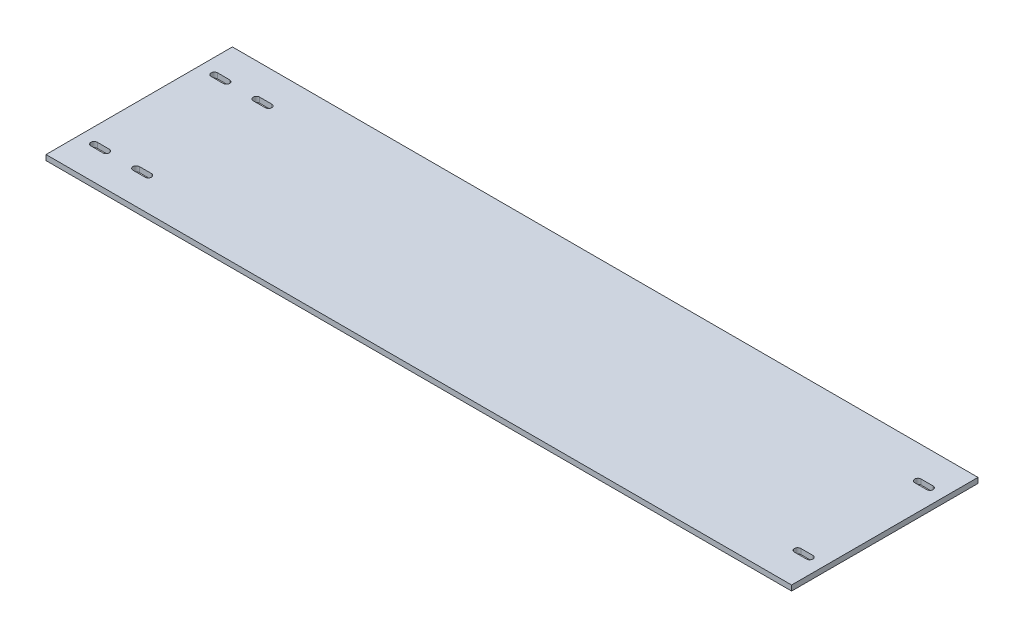
ISO-10303-21;
HEADER;
FILE_DESCRIPTION(('STEP AP214'),'2;1');
FILE_NAME('part.step','',(''),(''),'','','');
FILE_SCHEMA(('AUTOMOTIVE_DESIGN { 1 0 10303 214 1 1 1 1 }'));
ENDSEC;
DATA;
#1=APPLICATION_CONTEXT('core data for automotive mechanical design processes');
#2=APPLICATION_PROTOCOL_DEFINITION('international standard','automotive_design',2000,#1);
#3=PRODUCT_CONTEXT('',#1,'mechanical');
#4=PRODUCT('Part','Part','',(#3));
#5=PRODUCT_RELATED_PRODUCT_CATEGORY('part','',(#4));
#6=PRODUCT_DEFINITION_FORMATION('','',#4);
#7=PRODUCT_DEFINITION_CONTEXT('part definition',#1,'design');
#8=PRODUCT_DEFINITION('design','',#6,#7);
#9=PRODUCT_DEFINITION_SHAPE('','',#8);
#10=(LENGTH_UNIT() NAMED_UNIT(*) SI_UNIT(.MILLI.,.METRE.));
#11=(NAMED_UNIT(*) PLANE_ANGLE_UNIT() SI_UNIT($,.RADIAN.));
#12=(NAMED_UNIT(*) SI_UNIT($,.STERADIAN.) SOLID_ANGLE_UNIT());
#13=UNCERTAINTY_MEASURE_WITH_UNIT(LENGTH_MEASURE(1.E-05),#10,'distance_accuracy_value','');
#14=(GEOMETRIC_REPRESENTATION_CONTEXT(3) GLOBAL_UNCERTAINTY_ASSIGNED_CONTEXT((#13)) GLOBAL_UNIT_ASSIGNED_CONTEXT((#10,
#11,#12)) REPRESENTATION_CONTEXT('',''));
#15=CARTESIAN_POINT('',(0.,0.,0.));
#16=DIRECTION('',(0.,0.,1.));
#17=DIRECTION('',(1.,0.,0.));
#18=AXIS2_PLACEMENT_3D('',#15,#16,#17);
#19=CARTESIAN_POINT('',(0.,5.588,0.));
#20=DIRECTION('',(0.,-1.,0.));
#21=DIRECTION('',(0.,0.,-1.));
#22=AXIS2_PLACEMENT_3D('',#19,#20,#21);
#23=PLANE('',#22);
#24=CARTESIAN_POINT('',(771.525,5.588,-161.925));
#25=DIRECTION('',(0.,1.,0.));
#26=DIRECTION('',(0.,0.,1.));
#27=AXIS2_PLACEMENT_3D('',#24,#25,#26);
#28=CIRCLE('',#27,3.3782);
#29=CARTESIAN_POINT('',(771.525,5.588,-158.5468));
#30=VERTEX_POINT('',#29);
#31=CARTESIAN_POINT('',(771.525,5.588,-165.3032));
#32=VERTEX_POINT('',#31);
#33=EDGE_CURVE('E254',#30,#32,#28,.T.);
#34=ORIENTED_EDGE('',*,*,#33,.F.);
#35=DIRECTION('',(1.,0.,0.));
#36=VECTOR('',#35,1.);
#37=CARTESIAN_POINT('',(771.525,5.588,-158.5468));
#38=LINE('',#37,#36);
#39=CARTESIAN_POINT('',(758.825,5.588,-158.5468));
#40=VERTEX_POINT('',#39);
#41=EDGE_CURVE('E262',#40,#30,#38,.T.);
#42=ORIENTED_EDGE('',*,*,#41,.F.);
#43=CARTESIAN_POINT('',(758.825,5.588,-161.925));
#44=DIRECTION('',(0.,1.,0.));
#45=DIRECTION('',(0.,0.,1.));
#46=AXIS2_PLACEMENT_3D('',#43,#44,#45);
#47=CIRCLE('',#46,3.3782);
#48=CARTESIAN_POINT('',(758.825,5.588,-165.3032));
#49=VERTEX_POINT('',#48);
#50=EDGE_CURVE('E259',#49,#40,#47,.T.);
#51=ORIENTED_EDGE('',*,*,#50,.F.);
#52=DIRECTION('',(-1.,0.,0.));
#53=VECTOR('',#52,1.);
#54=CARTESIAN_POINT('',(771.525,5.588,-165.3032));
#55=LINE('',#54,#53);
#56=EDGE_CURVE('E256',#32,#49,#55,.T.);
#57=ORIENTED_EDGE('',*,*,#56,.F.);
#58=EDGE_LOOP('',(#34,#42,#51,#57));
#59=FACE_BOUND('',#58,.T.);
#60=CARTESIAN_POINT('',(60.325,5.588,-161.925));
#61=DIRECTION('',(0.,1.,0.));
#62=DIRECTION('',(0.,0.,1.));
#63=AXIS2_PLACEMENT_3D('',#60,#61,#62);
#64=CIRCLE('',#63,3.3782);
#65=CARTESIAN_POINT('',(60.325,5.588,-165.3032));
#66=VERTEX_POINT('',#65);
#67=CARTESIAN_POINT('',(60.325,5.588,-158.5468));
#68=VERTEX_POINT('',#67);
#69=EDGE_CURVE('E316',#66,#68,#64,.T.);
#70=ORIENTED_EDGE('',*,*,#69,.F.);
#71=DIRECTION('',(-1.,0.,0.));
#72=VECTOR('',#71,1.);
#73=CARTESIAN_POINT('',(60.325,5.588,-165.3032));
#74=LINE('',#73,#72);
#75=CARTESIAN_POINT('',(73.025,5.588,-165.3032));
#76=VERTEX_POINT('',#75);
#77=EDGE_CURVE('E324',#76,#66,#74,.T.);
#78=ORIENTED_EDGE('',*,*,#77,.F.);
#79=CARTESIAN_POINT('',(73.025,5.588,-161.925));
#80=DIRECTION('',(0.,1.,0.));
#81=DIRECTION('',(0.,0.,1.));
#82=AXIS2_PLACEMENT_3D('',#79,#80,#81);
#83=CIRCLE('',#82,3.3782);
#84=CARTESIAN_POINT('',(73.025,5.588,-158.5468));
#85=VERTEX_POINT('',#84);
#86=EDGE_CURVE('E321',#85,#76,#83,.T.);
#87=ORIENTED_EDGE('',*,*,#86,.F.);
#88=DIRECTION('',(1.,0.,0.));
#89=VECTOR('',#88,1.);
#90=CARTESIAN_POINT('',(60.325,5.588,-158.5468));
#91=LINE('',#90,#89);
#92=EDGE_CURVE('E318',#68,#85,#91,.T.);
#93=ORIENTED_EDGE('',*,*,#92,.F.);
#94=EDGE_LOOP('',(#70,#78,#87,#93));
#95=FACE_BOUND('',#94,.T.);
#96=CARTESIAN_POINT('',(15.875,5.588,-34.925));
#97=DIRECTION('',(0.,1.,0.));
#98=DIRECTION('',(0.,0.,1.));
#99=AXIS2_PLACEMENT_3D('',#96,#97,#98);
#100=CIRCLE('',#99,3.3782);
#101=CARTESIAN_POINT('',(15.875,5.588,-38.3032));
#102=VERTEX_POINT('',#101);
#103=CARTESIAN_POINT('',(15.875,5.588,-31.5468));
#104=VERTEX_POINT('',#103);
#105=EDGE_CURVE('E378',#102,#104,#100,.T.);
#106=ORIENTED_EDGE('',*,*,#105,.F.);
#107=DIRECTION('',(-1.,0.,0.));
#108=VECTOR('',#107,1.);
#109=CARTESIAN_POINT('',(15.875,5.588,-38.3032));
#110=LINE('',#109,#108);
#111=CARTESIAN_POINT('',(28.575,5.588,-38.3032));
#112=VERTEX_POINT('',#111);
#113=EDGE_CURVE('E386',#112,#102,#110,.T.);
#114=ORIENTED_EDGE('',*,*,#113,.F.);
#115=CARTESIAN_POINT('',(28.575,5.588,-34.925));
#116=DIRECTION('',(0.,1.,0.));
#117=DIRECTION('',(0.,0.,1.));
#118=AXIS2_PLACEMENT_3D('',#115,#116,#117);
#119=CIRCLE('',#118,3.3782);
#120=CARTESIAN_POINT('',(28.575,5.588,-31.5468));
#121=VERTEX_POINT('',#120);
#122=EDGE_CURVE('E383',#121,#112,#119,.T.);
#123=ORIENTED_EDGE('',*,*,#122,.F.);
#124=DIRECTION('',(1.,0.,0.));
#125=VECTOR('',#124,1.);
#126=CARTESIAN_POINT('',(15.875,5.588,-31.5468));
#127=LINE('',#126,#125);
#128=EDGE_CURVE('E380',#104,#121,#127,.T.);
#129=ORIENTED_EDGE('',*,*,#128,.F.);
#130=EDGE_LOOP('',(#106,#114,#123,#129));
#131=FACE_BOUND('',#130,.T.);
#132=DIRECTION('',(0.,0.,1.));
#133=VECTOR('',#132,1.);
#134=CARTESIAN_POINT('',(0.,5.588,0.));
#135=LINE('',#134,#133);
#136=CARTESIAN_POINT('',(0.,5.588,-196.85));
#137=VERTEX_POINT('',#136);
#138=CARTESIAN_POINT('',(0.,5.588,0.));
#139=VERTEX_POINT('',#138);
#140=EDGE_CURVE('E409',#137,#139,#135,.T.);
#141=ORIENTED_EDGE('',*,*,#140,.T.);
#142=DIRECTION('',(1.,0.,0.));
#143=VECTOR('',#142,1.);
#144=CARTESIAN_POINT('',(0.,5.588,0.));
#145=LINE('',#144,#143);
#146=CARTESIAN_POINT('',(787.4,5.588,0.));
#147=VERTEX_POINT('',#146);
#148=EDGE_CURVE('E412',#139,#147,#145,.T.);
#149=ORIENTED_EDGE('',*,*,#148,.T.);
#150=DIRECTION('',(0.,0.,-1.));
#151=VECTOR('',#150,1.);
#152=CARTESIAN_POINT('',(787.4,5.588,0.));
#153=LINE('',#152,#151);
#154=CARTESIAN_POINT('',(787.4,5.588,-196.85));
#155=VERTEX_POINT('',#154);
#156=EDGE_CURVE('E415',#147,#155,#153,.T.);
#157=ORIENTED_EDGE('',*,*,#156,.T.);
#158=DIRECTION('',(-1.,0.,0.));
#159=VECTOR('',#158,1.);
#160=CARTESIAN_POINT('',(0.,5.588,-196.85));
#161=LINE('',#160,#159);
#162=EDGE_CURVE('E417',#155,#137,#161,.T.);
#163=ORIENTED_EDGE('',*,*,#162,.T.);
#164=EDGE_LOOP('',(#141,#149,#157,#163));
#165=FACE_BOUND('',#164,.T.);
#166=CARTESIAN_POINT('',(15.875,5.588,-161.925));
#167=DIRECTION('',(0.,1.,0.));
#168=DIRECTION('',(0.,0.,1.));
#169=AXIS2_PLACEMENT_3D('',#166,#167,#168);
#170=CIRCLE('',#169,3.3782);
#171=CARTESIAN_POINT('',(15.875,5.588,-165.3032));
#172=VERTEX_POINT('',#171);
#173=CARTESIAN_POINT('',(15.875,5.588,-158.5468));
#174=VERTEX_POINT('',#173);
#175=EDGE_CURVE('E347',#172,#174,#170,.T.);
#176=ORIENTED_EDGE('',*,*,#175,.F.);
#177=DIRECTION('',(-1.,0.,0.));
#178=VECTOR('',#177,1.);
#179=CARTESIAN_POINT('',(15.875,5.588,-165.3032));
#180=LINE('',#179,#178);
#181=CARTESIAN_POINT('',(28.575,5.588,-165.3032));
#182=VERTEX_POINT('',#181);
#183=EDGE_CURVE('E355',#182,#172,#180,.T.);
#184=ORIENTED_EDGE('',*,*,#183,.F.);
#185=CARTESIAN_POINT('',(28.575,5.588,-161.925));
#186=DIRECTION('',(0.,1.,0.));
#187=DIRECTION('',(0.,0.,1.));
#188=AXIS2_PLACEMENT_3D('',#185,#186,#187);
#189=CIRCLE('',#188,3.3782);
#190=CARTESIAN_POINT('',(28.575,5.588,-158.5468));
#191=VERTEX_POINT('',#190);
#192=EDGE_CURVE('E352',#191,#182,#189,.T.);
#193=ORIENTED_EDGE('',*,*,#192,.F.);
#194=DIRECTION('',(1.,0.,0.));
#195=VECTOR('',#194,1.);
#196=CARTESIAN_POINT('',(15.875,5.588,-158.5468));
#197=LINE('',#196,#195);
#198=EDGE_CURVE('E349',#174,#191,#197,.T.);
#199=ORIENTED_EDGE('',*,*,#198,.F.);
#200=EDGE_LOOP('',(#176,#184,#193,#199));
#201=FACE_BOUND('',#200,.T.);
#202=CARTESIAN_POINT('',(60.325,5.588,-34.925));
#203=DIRECTION('',(0.,1.,0.));
#204=DIRECTION('',(0.,0.,1.));
#205=AXIS2_PLACEMENT_3D('',#202,#203,#204);
#206=CIRCLE('',#205,3.3782);
#207=CARTESIAN_POINT('',(60.325,5.588,-38.3032));
#208=VERTEX_POINT('',#207);
#209=CARTESIAN_POINT('',(60.325,5.588,-31.5468));
#210=VERTEX_POINT('',#209);
#211=EDGE_CURVE('E285',#208,#210,#206,.T.);
#212=ORIENTED_EDGE('',*,*,#211,.F.);
#213=DIRECTION('',(-1.,0.,0.));
#214=VECTOR('',#213,1.);
#215=CARTESIAN_POINT('',(60.325,5.588,-38.3032));
#216=LINE('',#215,#214);
#217=CARTESIAN_POINT('',(73.025,5.588,-38.3032));
#218=VERTEX_POINT('',#217);
#219=EDGE_CURVE('E293',#218,#208,#216,.T.);
#220=ORIENTED_EDGE('',*,*,#219,.F.);
#221=CARTESIAN_POINT('',(73.025,5.588,-34.925));
#222=DIRECTION('',(0.,1.,0.));
#223=DIRECTION('',(0.,0.,1.));
#224=AXIS2_PLACEMENT_3D('',#221,#222,#223);
#225=CIRCLE('',#224,3.3782);
#226=CARTESIAN_POINT('',(73.025,5.588,-31.5468));
#227=VERTEX_POINT('',#226);
#228=EDGE_CURVE('E290',#227,#218,#225,.T.);
#229=ORIENTED_EDGE('',*,*,#228,.F.);
#230=DIRECTION('',(1.,0.,0.));
#231=VECTOR('',#230,1.);
#232=CARTESIAN_POINT('',(60.325,5.588,-31.5468));
#233=LINE('',#232,#231);
#234=EDGE_CURVE('E287',#210,#227,#233,.T.);
#235=ORIENTED_EDGE('',*,*,#234,.F.);
#236=EDGE_LOOP('',(#212,#220,#229,#235));
#237=FACE_BOUND('',#236,.T.);
#238=CARTESIAN_POINT('',(771.525,5.588,-34.925));
#239=DIRECTION('',(0.,1.,0.));
#240=DIRECTION('',(0.,0.,1.));
#241=AXIS2_PLACEMENT_3D('',#238,#239,#240);
#242=CIRCLE('',#241,3.3782);
#243=CARTESIAN_POINT('',(771.525,5.588,-31.5468));
#244=VERTEX_POINT('',#243);
#245=CARTESIAN_POINT('',(771.525,5.588,-38.3032));
#246=VERTEX_POINT('',#245);
#247=EDGE_CURVE('E218',#244,#246,#242,.T.);
#248=ORIENTED_EDGE('',*,*,#247,.F.);
#249=DIRECTION('',(1.,0.,0.));
#250=VECTOR('',#249,1.);
#251=CARTESIAN_POINT('',(771.525,5.588,-31.5468));
#252=LINE('',#251,#250);
#253=CARTESIAN_POINT('',(758.825,5.588,-31.5468));
#254=VERTEX_POINT('',#253);
#255=EDGE_CURVE('E240',#254,#244,#252,.T.);
#256=ORIENTED_EDGE('',*,*,#255,.F.);
#257=CARTESIAN_POINT('',(758.825,5.588,-34.925));
#258=DIRECTION('',(0.,1.,0.));
#259=DIRECTION('',(0.,0.,1.));
#260=AXIS2_PLACEMENT_3D('',#257,#258,#259);
#261=CIRCLE('',#260,3.3782);
#262=CARTESIAN_POINT('',(758.825,5.588,-38.3032));
#263=VERTEX_POINT('',#262);
#264=EDGE_CURVE('E238',#263,#254,#261,.T.);
#265=ORIENTED_EDGE('',*,*,#264,.F.);
#266=DIRECTION('',(-1.,0.,0.));
#267=VECTOR('',#266,1.);
#268=CARTESIAN_POINT('',(771.525,5.588,-38.3032));
#269=LINE('',#268,#267);
#270=EDGE_CURVE('E226',#246,#263,#269,.T.);
#271=ORIENTED_EDGE('',*,*,#270,.F.);
#272=EDGE_LOOP('',(#248,#256,#265,#271));
#273=FACE_BOUND('',#272,.T.);
#274=ADVANCED_FACE('F33',(#59,#95,#131,#165,#201,#237,#273),#23,.F.);
#275=CARTESIAN_POINT('',(0.,0.,0.));
#276=DIRECTION('',(0.,-1.,0.));
#277=DIRECTION('',(0.,0.,-1.));
#278=AXIS2_PLACEMENT_3D('',#275,#276,#277);
#279=PLANE('',#278);
#280=DIRECTION('',(0.,0.,1.));
#281=VECTOR('',#280,1.);
#282=CARTESIAN_POINT('',(0.,0.,0.));
#283=LINE('',#282,#281);
#284=CARTESIAN_POINT('',(0.,0.,-196.85));
#285=VERTEX_POINT('',#284);
#286=CARTESIAN_POINT('',(0.,0.,0.));
#287=VERTEX_POINT('',#286);
#288=EDGE_CURVE('E408',#285,#287,#283,.T.);
#289=ORIENTED_EDGE('',*,*,#288,.F.);
#290=DIRECTION('',(-1.,0.,0.));
#291=VECTOR('',#290,1.);
#292=CARTESIAN_POINT('',(0.,0.,-196.85));
#293=LINE('',#292,#291);
#294=CARTESIAN_POINT('',(787.4,0.,-196.85));
#295=VERTEX_POINT('',#294);
#296=EDGE_CURVE('E413',#295,#285,#293,.T.);
#297=ORIENTED_EDGE('',*,*,#296,.F.);
#298=DIRECTION('',(0.,0.,-1.));
#299=VECTOR('',#298,1.);
#300=CARTESIAN_POINT('',(787.4,0.,0.));
#301=LINE('',#300,#299);
#302=CARTESIAN_POINT('',(787.4,0.,0.));
#303=VERTEX_POINT('',#302);
#304=EDGE_CURVE('E424',#303,#295,#301,.T.);
#305=ORIENTED_EDGE('',*,*,#304,.F.);
#306=DIRECTION('',(1.,0.,0.));
#307=VECTOR('',#306,1.);
#308=CARTESIAN_POINT('',(0.,0.,0.));
#309=LINE('',#308,#307);
#310=EDGE_CURVE('E422',#287,#303,#309,.T.);
#311=ORIENTED_EDGE('',*,*,#310,.F.);
#312=EDGE_LOOP('',(#289,#297,#305,#311));
#313=FACE_BOUND('',#312,.T.);
#314=DIRECTION('',(-1.,0.,0.));
#315=VECTOR('',#314,1.);
#316=CARTESIAN_POINT('',(15.875,0.,-38.3032));
#317=LINE('',#316,#315);
#318=CARTESIAN_POINT('',(28.575,0.,-38.3032));
#319=VERTEX_POINT('',#318);
#320=CARTESIAN_POINT('',(15.875,0.,-38.3032));
#321=VERTEX_POINT('',#320);
#322=EDGE_CURVE('E381',#319,#321,#317,.T.);
#323=ORIENTED_EDGE('',*,*,#322,.T.);
#324=CARTESIAN_POINT('',(15.875,0.,-34.925));
#325=DIRECTION('',(0.,1.,0.));
#326=DIRECTION('',(0.,0.,1.));
#327=AXIS2_PLACEMENT_3D('',#324,#325,#326);
#328=CIRCLE('',#327,3.3782);
#329=CARTESIAN_POINT('',(15.875,0.,-31.5468));
#330=VERTEX_POINT('',#329);
#331=EDGE_CURVE('E377',#321,#330,#328,.T.);
#332=ORIENTED_EDGE('',*,*,#331,.T.);
#333=DIRECTION('',(1.,0.,0.));
#334=VECTOR('',#333,1.);
#335=CARTESIAN_POINT('',(15.875,0.,-31.5468));
#336=LINE('',#335,#334);
#337=CARTESIAN_POINT('',(28.575,0.,-31.5468));
#338=VERTEX_POINT('',#337);
#339=EDGE_CURVE('E391',#330,#338,#336,.T.);
#340=ORIENTED_EDGE('',*,*,#339,.T.);
#341=CARTESIAN_POINT('',(28.575,0.,-34.925));
#342=DIRECTION('',(0.,1.,0.));
#343=DIRECTION('',(0.,0.,1.));
#344=AXIS2_PLACEMENT_3D('',#341,#342,#343);
#345=CIRCLE('',#344,3.3782);
#346=EDGE_CURVE('E394',#338,#319,#345,.T.);
#347=ORIENTED_EDGE('',*,*,#346,.T.);
#348=EDGE_LOOP('',(#323,#332,#340,#347));
#349=FACE_BOUND('',#348,.T.);
#350=DIRECTION('',(-1.,0.,0.));
#351=VECTOR('',#350,1.);
#352=CARTESIAN_POINT('',(15.875,0.,-165.3032));
#353=LINE('',#352,#351);
#354=CARTESIAN_POINT('',(28.575,0.,-165.3032));
#355=VERTEX_POINT('',#354);
#356=CARTESIAN_POINT('',(15.875,0.,-165.3032));
#357=VERTEX_POINT('',#356);
#358=EDGE_CURVE('E350',#355,#357,#353,.T.);
#359=ORIENTED_EDGE('',*,*,#358,.T.);
#360=CARTESIAN_POINT('',(15.875,0.,-161.925));
#361=DIRECTION('',(0.,1.,0.));
#362=DIRECTION('',(0.,0.,1.));
#363=AXIS2_PLACEMENT_3D('',#360,#361,#362);
#364=CIRCLE('',#363,3.3782);
#365=CARTESIAN_POINT('',(15.875,0.,-158.5468));
#366=VERTEX_POINT('',#365);
#367=EDGE_CURVE('E346',#357,#366,#364,.T.);
#368=ORIENTED_EDGE('',*,*,#367,.T.);
#369=DIRECTION('',(1.,0.,0.));
#370=VECTOR('',#369,1.);
#371=CARTESIAN_POINT('',(15.875,0.,-158.5468));
#372=LINE('',#371,#370);
#373=CARTESIAN_POINT('',(28.575,0.,-158.5468));
#374=VERTEX_POINT('',#373);
#375=EDGE_CURVE('E360',#366,#374,#372,.T.);
#376=ORIENTED_EDGE('',*,*,#375,.T.);
#377=CARTESIAN_POINT('',(28.575,0.,-161.925));
#378=DIRECTION('',(0.,1.,0.));
#379=DIRECTION('',(0.,0.,1.));
#380=AXIS2_PLACEMENT_3D('',#377,#378,#379);
#381=CIRCLE('',#380,3.3782);
#382=EDGE_CURVE('E363',#374,#355,#381,.T.);
#383=ORIENTED_EDGE('',*,*,#382,.T.);
#384=EDGE_LOOP('',(#359,#368,#376,#383));
#385=FACE_BOUND('',#384,.T.);
#386=DIRECTION('',(-1.,0.,0.));
#387=VECTOR('',#386,1.);
#388=CARTESIAN_POINT('',(60.325,0.,-165.3032));
#389=LINE('',#388,#387);
#390=CARTESIAN_POINT('',(73.025,0.,-165.3032));
#391=VERTEX_POINT('',#390);
#392=CARTESIAN_POINT('',(60.325,0.,-165.3032));
#393=VERTEX_POINT('',#392);
#394=EDGE_CURVE('E319',#391,#393,#389,.T.);
#395=ORIENTED_EDGE('',*,*,#394,.T.);
#396=CARTESIAN_POINT('',(60.325,0.,-161.925));
#397=DIRECTION('',(0.,1.,0.));
#398=DIRECTION('',(0.,0.,1.));
#399=AXIS2_PLACEMENT_3D('',#396,#397,#398);
#400=CIRCLE('',#399,3.3782);
#401=CARTESIAN_POINT('',(60.325,0.,-158.5468));
#402=VERTEX_POINT('',#401);
#403=EDGE_CURVE('E315',#393,#402,#400,.T.);
#404=ORIENTED_EDGE('',*,*,#403,.T.);
#405=DIRECTION('',(1.,0.,0.));
#406=VECTOR('',#405,1.);
#407=CARTESIAN_POINT('',(60.325,0.,-158.5468));
#408=LINE('',#407,#406);
#409=CARTESIAN_POINT('',(73.025,0.,-158.5468));
#410=VERTEX_POINT('',#409);
#411=EDGE_CURVE('E329',#402,#410,#408,.T.);
#412=ORIENTED_EDGE('',*,*,#411,.T.);
#413=CARTESIAN_POINT('',(73.025,0.,-161.925));
#414=DIRECTION('',(0.,1.,0.));
#415=DIRECTION('',(0.,0.,1.));
#416=AXIS2_PLACEMENT_3D('',#413,#414,#415);
#417=CIRCLE('',#416,3.3782);
#418=EDGE_CURVE('E332',#410,#391,#417,.T.);
#419=ORIENTED_EDGE('',*,*,#418,.T.);
#420=EDGE_LOOP('',(#395,#404,#412,#419));
#421=FACE_BOUND('',#420,.T.);
#422=DIRECTION('',(-1.,0.,0.));
#423=VECTOR('',#422,1.);
#424=CARTESIAN_POINT('',(60.325,0.,-38.3032));
#425=LINE('',#424,#423);
#426=CARTESIAN_POINT('',(73.025,0.,-38.3032));
#427=VERTEX_POINT('',#426);
#428=CARTESIAN_POINT('',(60.325,0.,-38.3032));
#429=VERTEX_POINT('',#428);
#430=EDGE_CURVE('E288',#427,#429,#425,.T.);
#431=ORIENTED_EDGE('',*,*,#430,.T.);
#432=CARTESIAN_POINT('',(60.325,0.,-34.925));
#433=DIRECTION('',(0.,1.,0.));
#434=DIRECTION('',(0.,0.,1.));
#435=AXIS2_PLACEMENT_3D('',#432,#433,#434);
#436=CIRCLE('',#435,3.3782);
#437=CARTESIAN_POINT('',(60.325,0.,-31.5468));
#438=VERTEX_POINT('',#437);
#439=EDGE_CURVE('E284',#429,#438,#436,.T.);
#440=ORIENTED_EDGE('',*,*,#439,.T.);
#441=DIRECTION('',(1.,0.,0.));
#442=VECTOR('',#441,1.);
#443=CARTESIAN_POINT('',(60.325,0.,-31.5468));
#444=LINE('',#443,#442);
#445=CARTESIAN_POINT('',(73.025,0.,-31.5468));
#446=VERTEX_POINT('',#445);
#447=EDGE_CURVE('E298',#438,#446,#444,.T.);
#448=ORIENTED_EDGE('',*,*,#447,.T.);
#449=CARTESIAN_POINT('',(73.025,0.,-34.925));
#450=DIRECTION('',(0.,1.,0.));
#451=DIRECTION('',(0.,0.,1.));
#452=AXIS2_PLACEMENT_3D('',#449,#450,#451);
#453=CIRCLE('',#452,3.3782);
#454=EDGE_CURVE('E301',#446,#427,#453,.T.);
#455=ORIENTED_EDGE('',*,*,#454,.T.);
#456=EDGE_LOOP('',(#431,#440,#448,#455));
#457=FACE_BOUND('',#456,.T.);
#458=DIRECTION('',(1.,0.,0.));
#459=VECTOR('',#458,1.);
#460=CARTESIAN_POINT('',(771.525,0.,-158.5468));
#461=LINE('',#460,#459);
#462=CARTESIAN_POINT('',(758.825,0.,-158.5468));
#463=VERTEX_POINT('',#462);
#464=CARTESIAN_POINT('',(771.525,0.,-158.5468));
#465=VERTEX_POINT('',#464);
#466=EDGE_CURVE('E257',#463,#465,#461,.T.);
#467=ORIENTED_EDGE('',*,*,#466,.T.);
#468=CARTESIAN_POINT('',(771.525,0.,-161.925));
#469=DIRECTION('',(0.,1.,0.));
#470=DIRECTION('',(0.,0.,1.));
#471=AXIS2_PLACEMENT_3D('',#468,#469,#470);
#472=CIRCLE('',#471,3.3782);
#473=CARTESIAN_POINT('',(771.525,0.,-165.3032));
#474=VERTEX_POINT('',#473);
#475=EDGE_CURVE('E234',#465,#474,#472,.T.);
#476=ORIENTED_EDGE('',*,*,#475,.T.);
#477=DIRECTION('',(-1.,0.,0.));
#478=VECTOR('',#477,1.);
#479=CARTESIAN_POINT('',(771.525,0.,-165.3032));
#480=LINE('',#479,#478);
#481=CARTESIAN_POINT('',(758.825,0.,-165.3032));
#482=VERTEX_POINT('',#481);
#483=EDGE_CURVE('E267',#474,#482,#480,.T.);
#484=ORIENTED_EDGE('',*,*,#483,.T.);
#485=CARTESIAN_POINT('',(758.825,0.,-161.925));
#486=DIRECTION('',(0.,1.,0.));
#487=DIRECTION('',(0.,0.,1.));
#488=AXIS2_PLACEMENT_3D('',#485,#486,#487);
#489=CIRCLE('',#488,3.3782);
#490=EDGE_CURVE('E270',#482,#463,#489,.T.);
#491=ORIENTED_EDGE('',*,*,#490,.T.);
#492=EDGE_LOOP('',(#467,#476,#484,#491));
#493=FACE_BOUND('',#492,.T.);
#494=DIRECTION('',(1.,0.,0.));
#495=VECTOR('',#494,1.);
#496=CARTESIAN_POINT('',(771.525,0.,-31.5468));
#497=LINE('',#496,#495);
#498=CARTESIAN_POINT('',(758.825,0.,-31.5468));
#499=VERTEX_POINT('',#498);
#500=CARTESIAN_POINT('',(771.525,0.,-31.5468));
#501=VERTEX_POINT('',#500);
#502=EDGE_CURVE('E227',#499,#501,#497,.T.);
#503=ORIENTED_EDGE('',*,*,#502,.T.);
#504=CARTESIAN_POINT('',(771.525,0.,-34.925));
#505=DIRECTION('',(0.,1.,0.));
#506=DIRECTION('',(0.,0.,1.));
#507=AXIS2_PLACEMENT_3D('',#504,#505,#506);
#508=CIRCLE('',#507,3.3782);
#509=CARTESIAN_POINT('',(771.525,0.,-38.3032));
#510=VERTEX_POINT('',#509);
#511=EDGE_CURVE('E56',#501,#510,#508,.T.);
#512=ORIENTED_EDGE('',*,*,#511,.T.);
#513=DIRECTION('',(-1.,0.,0.));
#514=VECTOR('',#513,1.);
#515=CARTESIAN_POINT('',(771.525,0.,-38.3032));
#516=LINE('',#515,#514);
#517=CARTESIAN_POINT('',(758.825,0.,-38.3032));
#518=VERTEX_POINT('',#517);
#519=EDGE_CURVE('E233',#510,#518,#516,.T.);
#520=ORIENTED_EDGE('',*,*,#519,.T.);
#521=CARTESIAN_POINT('',(758.825,0.,-34.925));
#522=DIRECTION('',(0.,1.,0.));
#523=DIRECTION('',(0.,0.,1.));
#524=AXIS2_PLACEMENT_3D('',#521,#522,#523);
#525=CIRCLE('',#524,3.3782);
#526=EDGE_CURVE('E246',#518,#499,#525,.T.);
#527=ORIENTED_EDGE('',*,*,#526,.T.);
#528=EDGE_LOOP('',(#503,#512,#520,#527));
#529=FACE_BOUND('',#528,.T.);
#530=ADVANCED_FACE('F442',(#313,#349,#385,#421,#457,#493,#529),#279,.T.);
#531=CARTESIAN_POINT('',(0.,5.588,0.));
#532=DIRECTION('',(1.,0.,0.));
#533=DIRECTION('',(0.,0.,-1.));
#534=AXIS2_PLACEMENT_3D('',#531,#532,#533);
#535=PLANE('',#534);
#536=ORIENTED_EDGE('',*,*,#288,.T.);
#537=DIRECTION('',(0.,-1.,0.));
#538=VECTOR('',#537,1.);
#539=CARTESIAN_POINT('',(0.,5.588,0.));
#540=LINE('',#539,#538);
#541=EDGE_CURVE('E11',#139,#287,#540,.T.);
#542=ORIENTED_EDGE('',*,*,#541,.F.);
#543=ORIENTED_EDGE('',*,*,#140,.F.);
#544=DIRECTION('',(0.,-1.,0.));
#545=VECTOR('',#544,1.);
#546=CARTESIAN_POINT('',(0.,5.588,-196.85));
#547=LINE('',#546,#545);
#548=EDGE_CURVE('E419',#137,#285,#547,.T.);
#549=ORIENTED_EDGE('',*,*,#548,.T.);
#550=EDGE_LOOP('',(#536,#542,#543,#549));
#551=FACE_BOUND('',#550,.T.);
#552=ADVANCED_FACE('F35',(#551),#535,.F.);
#553=CARTESIAN_POINT('',(0.,5.588,0.));
#554=DIRECTION('',(0.,0.,-1.));
#555=DIRECTION('',(-1.,0.,0.));
#556=AXIS2_PLACEMENT_3D('',#553,#554,#555);
#557=PLANE('',#556);
#558=ORIENTED_EDGE('',*,*,#310,.T.);
#559=DIRECTION('',(0.,-1.,0.));
#560=VECTOR('',#559,1.);
#561=CARTESIAN_POINT('',(787.4,5.588,0.));
#562=LINE('',#561,#560);
#563=EDGE_CURVE('E41',#147,#303,#562,.T.);
#564=ORIENTED_EDGE('',*,*,#563,.F.);
#565=ORIENTED_EDGE('',*,*,#148,.F.);
#566=ORIENTED_EDGE('',*,*,#541,.T.);
#567=EDGE_LOOP('',(#558,#564,#565,#566));
#568=FACE_BOUND('',#567,.T.);
#569=ADVANCED_FACE('F453',(#568),#557,.F.);
#570=CARTESIAN_POINT('',(787.4,5.588,0.));
#571=DIRECTION('',(-1.,0.,0.));
#572=DIRECTION('',(0.,0.,1.));
#573=AXIS2_PLACEMENT_3D('',#570,#571,#572);
#574=PLANE('',#573);
#575=ORIENTED_EDGE('',*,*,#304,.T.);
#576=DIRECTION('',(0.,-1.,0.));
#577=VECTOR('',#576,1.);
#578=CARTESIAN_POINT('',(787.4,5.588,-196.85));
#579=LINE('',#578,#577);
#580=EDGE_CURVE('E429',#155,#295,#579,.T.);
#581=ORIENTED_EDGE('',*,*,#580,.F.);
#582=ORIENTED_EDGE('',*,*,#156,.F.);
#583=ORIENTED_EDGE('',*,*,#563,.T.);
#584=EDGE_LOOP('',(#575,#581,#582,#583));
#585=FACE_BOUND('',#584,.T.);
#586=ADVANCED_FACE('F436',(#585),#574,.F.);
#587=CARTESIAN_POINT('',(0.,5.588,-196.85));
#588=DIRECTION('',(0.,0.,1.));
#589=DIRECTION('',(1.,0.,0.));
#590=AXIS2_PLACEMENT_3D('',#587,#588,#589);
#591=PLANE('',#590);
#592=ORIENTED_EDGE('',*,*,#296,.T.);
#593=ORIENTED_EDGE('',*,*,#548,.F.);
#594=ORIENTED_EDGE('',*,*,#162,.F.);
#595=ORIENTED_EDGE('',*,*,#580,.T.);
#596=EDGE_LOOP('',(#592,#593,#594,#595));
#597=FACE_BOUND('',#596,.T.);
#598=ADVANCED_FACE('F446',(#597),#591,.F.);
#599=CARTESIAN_POINT('',(15.875,5.588,-34.925));
#600=DIRECTION('',(0.,-1.,0.));
#601=DIRECTION('',(0.,0.,-1.));
#602=AXIS2_PLACEMENT_3D('',#599,#600,#601);
#603=CYLINDRICAL_SURFACE('',#602,3.3782);
#604=ORIENTED_EDGE('',*,*,#331,.F.);
#605=DIRECTION('',(0.,-1.,0.));
#606=VECTOR('',#605,1.);
#607=CARTESIAN_POINT('',(15.875,5.588,-38.3032));
#608=LINE('',#607,#606);
#609=EDGE_CURVE('E388',#102,#321,#608,.T.);
#610=ORIENTED_EDGE('',*,*,#609,.F.);
#611=ORIENTED_EDGE('',*,*,#105,.T.);
#612=DIRECTION('',(0.,-1.,0.));
#613=VECTOR('',#612,1.);
#614=CARTESIAN_POINT('',(15.875,5.588,-31.5468));
#615=LINE('',#614,#613);
#616=EDGE_CURVE('E405',#104,#330,#615,.T.);
#617=ORIENTED_EDGE('',*,*,#616,.T.);
#618=EDGE_LOOP('',(#604,#610,#611,#617));
#619=FACE_BOUND('',#618,.T.);
#620=ADVANCED_FACE('F470',(#619),#603,.F.);
#621=CARTESIAN_POINT('',(15.875,5.588,-31.5468));
#622=DIRECTION('',(0.,0.,-1.));
#623=DIRECTION('',(-1.,0.,0.));
#624=AXIS2_PLACEMENT_3D('',#621,#622,#623);
#625=PLANE('',#624);
#626=ORIENTED_EDGE('',*,*,#339,.F.);
#627=ORIENTED_EDGE('',*,*,#616,.F.);
#628=ORIENTED_EDGE('',*,*,#128,.T.);
#629=DIRECTION('',(0.,-1.,0.));
#630=VECTOR('',#629,1.);
#631=CARTESIAN_POINT('',(28.575,5.588,-31.5468));
#632=LINE('',#631,#630);
#633=EDGE_CURVE('E403',#121,#338,#632,.T.);
#634=ORIENTED_EDGE('',*,*,#633,.T.);
#635=EDGE_LOOP('',(#626,#627,#628,#634));
#636=FACE_BOUND('',#635,.T.);
#637=ADVANCED_FACE('F477',(#636),#625,.T.);
#638=CARTESIAN_POINT('',(28.575,5.588,-34.925));
#639=DIRECTION('',(0.,-1.,0.));
#640=DIRECTION('',(0.,0.,-1.));
#641=AXIS2_PLACEMENT_3D('',#638,#639,#640);
#642=CYLINDRICAL_SURFACE('',#641,3.3782);
#643=ORIENTED_EDGE('',*,*,#346,.F.);
#644=ORIENTED_EDGE('',*,*,#633,.F.);
#645=ORIENTED_EDGE('',*,*,#122,.T.);
#646=DIRECTION('',(0.,-1.,0.));
#647=VECTOR('',#646,1.);
#648=CARTESIAN_POINT('',(28.575,5.588,-38.3032));
#649=LINE('',#648,#647);
#650=EDGE_CURVE('E401',#112,#319,#649,.T.);
#651=ORIENTED_EDGE('',*,*,#650,.T.);
#652=EDGE_LOOP('',(#643,#644,#645,#651));
#653=FACE_BOUND('',#652,.T.);
#654=ADVANCED_FACE('F482',(#653),#642,.F.);
#655=CARTESIAN_POINT('',(15.875,5.588,-38.3032));
#656=DIRECTION('',(0.,0.,1.));
#657=DIRECTION('',(1.,0.,0.));
#658=AXIS2_PLACEMENT_3D('',#655,#656,#657);
#659=PLANE('',#658);
#660=ORIENTED_EDGE('',*,*,#322,.F.);
#661=ORIENTED_EDGE('',*,*,#650,.F.);
#662=ORIENTED_EDGE('',*,*,#113,.T.);
#663=ORIENTED_EDGE('',*,*,#609,.T.);
#664=EDGE_LOOP('',(#660,#661,#662,#663));
#665=FACE_BOUND('',#664,.T.);
#666=ADVANCED_FACE('F489',(#665),#659,.T.);
#667=CARTESIAN_POINT('',(15.875,5.588,-161.925));
#668=DIRECTION('',(0.,-1.,0.));
#669=DIRECTION('',(0.,0.,-1.));
#670=AXIS2_PLACEMENT_3D('',#667,#668,#669);
#671=CYLINDRICAL_SURFACE('',#670,3.3782);
#672=ORIENTED_EDGE('',*,*,#367,.F.);
#673=DIRECTION('',(0.,-1.,0.));
#674=VECTOR('',#673,1.);
#675=CARTESIAN_POINT('',(15.875,5.588,-165.3032));
#676=LINE('',#675,#674);
#677=EDGE_CURVE('E357',#172,#357,#676,.T.);
#678=ORIENTED_EDGE('',*,*,#677,.F.);
#679=ORIENTED_EDGE('',*,*,#175,.T.);
#680=DIRECTION('',(0.,-1.,0.));
#681=VECTOR('',#680,1.);
#682=CARTESIAN_POINT('',(15.875,5.588,-158.5468));
#683=LINE('',#682,#681);
#684=EDGE_CURVE('E374',#174,#366,#683,.T.);
#685=ORIENTED_EDGE('',*,*,#684,.T.);
#686=EDGE_LOOP('',(#672,#678,#679,#685));
#687=FACE_BOUND('',#686,.T.);
#688=ADVANCED_FACE('F503',(#687),#671,.F.);
#689=CARTESIAN_POINT('',(15.875,5.588,-158.5468));
#690=DIRECTION('',(0.,0.,-1.));
#691=DIRECTION('',(-1.,0.,0.));
#692=AXIS2_PLACEMENT_3D('',#689,#690,#691);
#693=PLANE('',#692);
#694=ORIENTED_EDGE('',*,*,#375,.F.);
#695=ORIENTED_EDGE('',*,*,#684,.F.);
#696=ORIENTED_EDGE('',*,*,#198,.T.);
#697=DIRECTION('',(0.,-1.,0.));
#698=VECTOR('',#697,1.);
#699=CARTESIAN_POINT('',(28.575,5.588,-158.5468));
#700=LINE('',#699,#698);
#701=EDGE_CURVE('E372',#191,#374,#700,.T.);
#702=ORIENTED_EDGE('',*,*,#701,.T.);
#703=EDGE_LOOP('',(#694,#695,#696,#702));
#704=FACE_BOUND('',#703,.T.);
#705=ADVANCED_FACE('F508',(#704),#693,.T.);
#706=CARTESIAN_POINT('',(28.575,5.588,-161.925));
#707=DIRECTION('',(0.,-1.,0.));
#708=DIRECTION('',(0.,0.,-1.));
#709=AXIS2_PLACEMENT_3D('',#706,#707,#708);
#710=CYLINDRICAL_SURFACE('',#709,3.3782);
#711=ORIENTED_EDGE('',*,*,#382,.F.);
#712=ORIENTED_EDGE('',*,*,#701,.F.);
#713=ORIENTED_EDGE('',*,*,#192,.T.);
#714=DIRECTION('',(0.,-1.,0.));
#715=VECTOR('',#714,1.);
#716=CARTESIAN_POINT('',(28.575,5.588,-165.3032));
#717=LINE('',#716,#715);
#718=EDGE_CURVE('E370',#182,#355,#717,.T.);
#719=ORIENTED_EDGE('',*,*,#718,.T.);
#720=EDGE_LOOP('',(#711,#712,#713,#719));
#721=FACE_BOUND('',#720,.T.);
#722=ADVANCED_FACE('F512',(#721),#710,.F.);
#723=CARTESIAN_POINT('',(15.875,5.588,-165.3032));
#724=DIRECTION('',(0.,0.,1.));
#725=DIRECTION('',(1.,0.,0.));
#726=AXIS2_PLACEMENT_3D('',#723,#724,#725);
#727=PLANE('',#726);
#728=ORIENTED_EDGE('',*,*,#358,.F.);
#729=ORIENTED_EDGE('',*,*,#718,.F.);
#730=ORIENTED_EDGE('',*,*,#183,.T.);
#731=ORIENTED_EDGE('',*,*,#677,.T.);
#732=EDGE_LOOP('',(#728,#729,#730,#731));
#733=FACE_BOUND('',#732,.T.);
#734=ADVANCED_FACE('F516',(#733),#727,.T.);
#735=CARTESIAN_POINT('',(60.325,5.588,-161.925));
#736=DIRECTION('',(0.,-1.,0.));
#737=DIRECTION('',(0.,0.,-1.));
#738=AXIS2_PLACEMENT_3D('',#735,#736,#737);
#739=CYLINDRICAL_SURFACE('',#738,3.3782);
#740=ORIENTED_EDGE('',*,*,#403,.F.);
#741=DIRECTION('',(0.,-1.,0.));
#742=VECTOR('',#741,1.);
#743=CARTESIAN_POINT('',(60.325,5.588,-165.3032));
#744=LINE('',#743,#742);
#745=EDGE_CURVE('E326',#66,#393,#744,.T.);
#746=ORIENTED_EDGE('',*,*,#745,.F.);
#747=ORIENTED_EDGE('',*,*,#69,.T.);
#748=DIRECTION('',(0.,-1.,0.));
#749=VECTOR('',#748,1.);
#750=CARTESIAN_POINT('',(60.325,5.588,-158.5468));
#751=LINE('',#750,#749);
#752=EDGE_CURVE('E343',#68,#402,#751,.T.);
#753=ORIENTED_EDGE('',*,*,#752,.T.);
#754=EDGE_LOOP('',(#740,#746,#747,#753));
#755=FACE_BOUND('',#754,.T.);
#756=ADVANCED_FACE('F520',(#755),#739,.F.);
#757=CARTESIAN_POINT('',(60.325,5.588,-158.5468));
#758=DIRECTION('',(0.,0.,-1.));
#759=DIRECTION('',(-1.,0.,0.));
#760=AXIS2_PLACEMENT_3D('',#757,#758,#759);
#761=PLANE('',#760);
#762=ORIENTED_EDGE('',*,*,#411,.F.);
#763=ORIENTED_EDGE('',*,*,#752,.F.);
#764=ORIENTED_EDGE('',*,*,#92,.T.);
#765=DIRECTION('',(0.,-1.,0.));
#766=VECTOR('',#765,1.);
#767=CARTESIAN_POINT('',(73.025,5.588,-158.5468));
#768=LINE('',#767,#766);
#769=EDGE_CURVE('E341',#85,#410,#768,.T.);
#770=ORIENTED_EDGE('',*,*,#769,.T.);
#771=EDGE_LOOP('',(#762,#763,#764,#770));
#772=FACE_BOUND('',#771,.T.);
#773=ADVANCED_FACE('F524',(#772),#761,.T.);
#774=CARTESIAN_POINT('',(73.025,5.588,-161.925));
#775=DIRECTION('',(0.,-1.,0.));
#776=DIRECTION('',(0.,0.,-1.));
#777=AXIS2_PLACEMENT_3D('',#774,#775,#776);
#778=CYLINDRICAL_SURFACE('',#777,3.3782);
#779=ORIENTED_EDGE('',*,*,#418,.F.);
#780=ORIENTED_EDGE('',*,*,#769,.F.);
#781=ORIENTED_EDGE('',*,*,#86,.T.);
#782=DIRECTION('',(0.,-1.,0.));
#783=VECTOR('',#782,1.);
#784=CARTESIAN_POINT('',(73.025,5.588,-165.3032));
#785=LINE('',#784,#783);
#786=EDGE_CURVE('E339',#76,#391,#785,.T.);
#787=ORIENTED_EDGE('',*,*,#786,.T.);
#788=EDGE_LOOP('',(#779,#780,#781,#787));
#789=FACE_BOUND('',#788,.T.);
#790=ADVANCED_FACE('F528',(#789),#778,.F.);
#791=CARTESIAN_POINT('',(60.325,5.588,-165.3032));
#792=DIRECTION('',(0.,0.,1.));
#793=DIRECTION('',(1.,0.,0.));
#794=AXIS2_PLACEMENT_3D('',#791,#792,#793);
#795=PLANE('',#794);
#796=ORIENTED_EDGE('',*,*,#394,.F.);
#797=ORIENTED_EDGE('',*,*,#786,.F.);
#798=ORIENTED_EDGE('',*,*,#77,.T.);
#799=ORIENTED_EDGE('',*,*,#745,.T.);
#800=EDGE_LOOP('',(#796,#797,#798,#799));
#801=FACE_BOUND('',#800,.T.);
#802=ADVANCED_FACE('F532',(#801),#795,.T.);
#803=CARTESIAN_POINT('',(60.325,5.588,-34.925));
#804=DIRECTION('',(0.,-1.,0.));
#805=DIRECTION('',(0.,0.,-1.));
#806=AXIS2_PLACEMENT_3D('',#803,#804,#805);
#807=CYLINDRICAL_SURFACE('',#806,3.3782);
#808=ORIENTED_EDGE('',*,*,#439,.F.);
#809=DIRECTION('',(0.,-1.,0.));
#810=VECTOR('',#809,1.);
#811=CARTESIAN_POINT('',(60.325,5.588,-38.3032));
#812=LINE('',#811,#810);
#813=EDGE_CURVE('E295',#208,#429,#812,.T.);
#814=ORIENTED_EDGE('',*,*,#813,.F.);
#815=ORIENTED_EDGE('',*,*,#211,.T.);
#816=DIRECTION('',(0.,-1.,0.));
#817=VECTOR('',#816,1.);
#818=CARTESIAN_POINT('',(60.325,5.588,-31.5468));
#819=LINE('',#818,#817);
#820=EDGE_CURVE('E312',#210,#438,#819,.T.);
#821=ORIENTED_EDGE('',*,*,#820,.T.);
#822=EDGE_LOOP('',(#808,#814,#815,#821));
#823=FACE_BOUND('',#822,.T.);
#824=ADVANCED_FACE('F536',(#823),#807,.F.);
#825=CARTESIAN_POINT('',(60.325,5.588,-31.5468));
#826=DIRECTION('',(0.,0.,-1.));
#827=DIRECTION('',(-1.,0.,0.));
#828=AXIS2_PLACEMENT_3D('',#825,#826,#827);
#829=PLANE('',#828);
#830=ORIENTED_EDGE('',*,*,#447,.F.);
#831=ORIENTED_EDGE('',*,*,#820,.F.);
#832=ORIENTED_EDGE('',*,*,#234,.T.);
#833=DIRECTION('',(0.,-1.,0.));
#834=VECTOR('',#833,1.);
#835=CARTESIAN_POINT('',(73.025,5.588,-31.5468));
#836=LINE('',#835,#834);
#837=EDGE_CURVE('E310',#227,#446,#836,.T.);
#838=ORIENTED_EDGE('',*,*,#837,.T.);
#839=EDGE_LOOP('',(#830,#831,#832,#838));
#840=FACE_BOUND('',#839,.T.);
#841=ADVANCED_FACE('F540',(#840),#829,.T.);
#842=CARTESIAN_POINT('',(73.025,5.588,-34.925));
#843=DIRECTION('',(0.,-1.,0.));
#844=DIRECTION('',(0.,0.,-1.));
#845=AXIS2_PLACEMENT_3D('',#842,#843,#844);
#846=CYLINDRICAL_SURFACE('',#845,3.3782);
#847=ORIENTED_EDGE('',*,*,#454,.F.);
#848=ORIENTED_EDGE('',*,*,#837,.F.);
#849=ORIENTED_EDGE('',*,*,#228,.T.);
#850=DIRECTION('',(0.,-1.,0.));
#851=VECTOR('',#850,1.);
#852=CARTESIAN_POINT('',(73.025,5.588,-38.3032));
#853=LINE('',#852,#851);
#854=EDGE_CURVE('E308',#218,#427,#853,.T.);
#855=ORIENTED_EDGE('',*,*,#854,.T.);
#856=EDGE_LOOP('',(#847,#848,#849,#855));
#857=FACE_BOUND('',#856,.T.);
#858=ADVANCED_FACE('F544',(#857),#846,.F.);
#859=CARTESIAN_POINT('',(60.325,5.588,-38.3032));
#860=DIRECTION('',(0.,0.,1.));
#861=DIRECTION('',(1.,0.,0.));
#862=AXIS2_PLACEMENT_3D('',#859,#860,#861);
#863=PLANE('',#862);
#864=ORIENTED_EDGE('',*,*,#430,.F.);
#865=ORIENTED_EDGE('',*,*,#854,.F.);
#866=ORIENTED_EDGE('',*,*,#219,.T.);
#867=ORIENTED_EDGE('',*,*,#813,.T.);
#868=EDGE_LOOP('',(#864,#865,#866,#867));
#869=FACE_BOUND('',#868,.T.);
#870=ADVANCED_FACE('F548',(#869),#863,.T.);
#871=CARTESIAN_POINT('',(771.525,5.588,-161.925));
#872=DIRECTION('',(0.,-1.,0.));
#873=DIRECTION('',(0.,0.,-1.));
#874=AXIS2_PLACEMENT_3D('',#871,#872,#873);
#875=CYLINDRICAL_SURFACE('',#874,3.3782);
#876=ORIENTED_EDGE('',*,*,#475,.F.);
#877=DIRECTION('',(0.,-1.,0.));
#878=VECTOR('',#877,1.);
#879=CARTESIAN_POINT('',(771.525,5.588,-158.5468));
#880=LINE('',#879,#878);
#881=EDGE_CURVE('E264',#30,#465,#880,.T.);
#882=ORIENTED_EDGE('',*,*,#881,.F.);
#883=ORIENTED_EDGE('',*,*,#33,.T.);
#884=DIRECTION('',(0.,-1.,0.));
#885=VECTOR('',#884,1.);
#886=CARTESIAN_POINT('',(771.525,5.588,-165.3032));
#887=LINE('',#886,#885);
#888=EDGE_CURVE('E281',#32,#474,#887,.T.);
#889=ORIENTED_EDGE('',*,*,#888,.T.);
#890=EDGE_LOOP('',(#876,#882,#883,#889));
#891=FACE_BOUND('',#890,.T.);
#892=ADVANCED_FACE('F552',(#891),#875,.F.);
#893=CARTESIAN_POINT('',(771.525,5.588,-165.3032));
#894=DIRECTION('',(0.,0.,1.));
#895=DIRECTION('',(1.,0.,0.));
#896=AXIS2_PLACEMENT_3D('',#893,#894,#895);
#897=PLANE('',#896);
#898=ORIENTED_EDGE('',*,*,#483,.F.);
#899=ORIENTED_EDGE('',*,*,#888,.F.);
#900=ORIENTED_EDGE('',*,*,#56,.T.);
#901=DIRECTION('',(0.,-1.,0.));
#902=VECTOR('',#901,1.);
#903=CARTESIAN_POINT('',(758.825,5.588,-165.3032));
#904=LINE('',#903,#902);
#905=EDGE_CURVE('E279',#49,#482,#904,.T.);
#906=ORIENTED_EDGE('',*,*,#905,.T.);
#907=EDGE_LOOP('',(#898,#899,#900,#906));
#908=FACE_BOUND('',#907,.T.);
#909=ADVANCED_FACE('F556',(#908),#897,.T.);
#910=CARTESIAN_POINT('',(758.825,5.588,-161.925));
#911=DIRECTION('',(0.,-1.,0.));
#912=DIRECTION('',(0.,0.,-1.));
#913=AXIS2_PLACEMENT_3D('',#910,#911,#912);
#914=CYLINDRICAL_SURFACE('',#913,3.3782);
#915=ORIENTED_EDGE('',*,*,#490,.F.);
#916=ORIENTED_EDGE('',*,*,#905,.F.);
#917=ORIENTED_EDGE('',*,*,#50,.T.);
#918=DIRECTION('',(0.,-1.,0.));
#919=VECTOR('',#918,1.);
#920=CARTESIAN_POINT('',(758.825,5.588,-158.5468));
#921=LINE('',#920,#919);
#922=EDGE_CURVE('E277',#40,#463,#921,.T.);
#923=ORIENTED_EDGE('',*,*,#922,.T.);
#924=EDGE_LOOP('',(#915,#916,#917,#923));
#925=FACE_BOUND('',#924,.T.);
#926=ADVANCED_FACE('F560',(#925),#914,.F.);
#927=CARTESIAN_POINT('',(771.525,5.588,-158.5468));
#928=DIRECTION('',(0.,0.,-1.));
#929=DIRECTION('',(-1.,0.,0.));
#930=AXIS2_PLACEMENT_3D('',#927,#928,#929);
#931=PLANE('',#930);
#932=ORIENTED_EDGE('',*,*,#466,.F.);
#933=ORIENTED_EDGE('',*,*,#922,.F.);
#934=ORIENTED_EDGE('',*,*,#41,.T.);
#935=ORIENTED_EDGE('',*,*,#881,.T.);
#936=EDGE_LOOP('',(#932,#933,#934,#935));
#937=FACE_BOUND('',#936,.T.);
#938=ADVANCED_FACE('F564',(#937),#931,.T.);
#939=CARTESIAN_POINT('',(771.525,5.588,-34.925));
#940=DIRECTION('',(0.,-1.,0.));
#941=DIRECTION('',(0.,0.,-1.));
#942=AXIS2_PLACEMENT_3D('',#939,#940,#941);
#943=CYLINDRICAL_SURFACE('',#942,3.3782);
#944=ORIENTED_EDGE('',*,*,#511,.F.);
#945=DIRECTION('',(0.,-1.,0.));
#946=VECTOR('',#945,1.);
#947=CARTESIAN_POINT('',(771.525,5.588,-31.5468));
#948=LINE('',#947,#946);
#949=EDGE_CURVE('E222',#244,#501,#948,.T.);
#950=ORIENTED_EDGE('',*,*,#949,.F.);
#951=ORIENTED_EDGE('',*,*,#247,.T.);
#952=DIRECTION('',(0.,-1.,0.));
#953=VECTOR('',#952,1.);
#954=CARTESIAN_POINT('',(771.525,5.588,-38.3032));
#955=LINE('',#954,#953);
#956=EDGE_CURVE('E221',#246,#510,#955,.T.);
#957=ORIENTED_EDGE('',*,*,#956,.T.);
#958=EDGE_LOOP('',(#944,#950,#951,#957));
#959=FACE_BOUND('',#958,.T.);
#960=ADVANCED_FACE('F220',(#959),#943,.F.);
#961=CARTESIAN_POINT('',(771.525,5.588,-38.3032));
#962=DIRECTION('',(0.,0.,1.));
#963=DIRECTION('',(1.,0.,0.));
#964=AXIS2_PLACEMENT_3D('',#961,#962,#963);
#965=PLANE('',#964);
#966=ORIENTED_EDGE('',*,*,#519,.F.);
#967=ORIENTED_EDGE('',*,*,#956,.F.);
#968=ORIENTED_EDGE('',*,*,#270,.T.);
#969=DIRECTION('',(0.,-1.,0.));
#970=VECTOR('',#969,1.);
#971=CARTESIAN_POINT('',(758.825,5.588,-38.3032));
#972=LINE('',#971,#970);
#973=EDGE_CURVE('E235',#263,#518,#972,.T.);
#974=ORIENTED_EDGE('',*,*,#973,.T.);
#975=EDGE_LOOP('',(#966,#967,#968,#974));
#976=FACE_BOUND('',#975,.T.);
#977=ADVANCED_FACE('F230',(#976),#965,.T.);
#978=CARTESIAN_POINT('',(758.825,5.588,-34.925));
#979=DIRECTION('',(0.,-1.,0.));
#980=DIRECTION('',(0.,0.,-1.));
#981=AXIS2_PLACEMENT_3D('',#978,#979,#980);
#982=CYLINDRICAL_SURFACE('',#981,3.3782);
#983=ORIENTED_EDGE('',*,*,#526,.F.);
#984=ORIENTED_EDGE('',*,*,#973,.F.);
#985=ORIENTED_EDGE('',*,*,#264,.T.);
#986=DIRECTION('',(0.,-1.,0.));
#987=VECTOR('',#986,1.);
#988=CARTESIAN_POINT('',(758.825,5.588,-31.5468));
#989=LINE('',#988,#987);
#990=EDGE_CURVE('E48',#254,#499,#989,.T.);
#991=ORIENTED_EDGE('',*,*,#990,.T.);
#992=EDGE_LOOP('',(#983,#984,#985,#991));
#993=FACE_BOUND('',#992,.T.);
#994=ADVANCED_FACE('F573',(#993),#982,.F.);
#995=CARTESIAN_POINT('',(771.525,5.588,-31.5468));
#996=DIRECTION('',(0.,0.,-1.));
#997=DIRECTION('',(-1.,0.,0.));
#998=AXIS2_PLACEMENT_3D('',#995,#996,#997);
#999=PLANE('',#998);
#1000=ORIENTED_EDGE('',*,*,#502,.F.);
#1001=ORIENTED_EDGE('',*,*,#990,.F.);
#1002=ORIENTED_EDGE('',*,*,#255,.T.);
#1003=ORIENTED_EDGE('',*,*,#949,.T.);
#1004=EDGE_LOOP('',(#1000,#1001,#1002,#1003));
#1005=FACE_BOUND('',#1004,.T.);
#1006=ADVANCED_FACE('F576',(#1005),#999,.T.);
#1007=CLOSED_SHELL('',(#274,#530,#552,#569,#586,#598,#620,#637,#654,#666,#688,#705,#722,#734,
#756,#773,#790,#802,#824,#841,#858,#870,#892,#909,#926,#938,#960,#977,#994,#1006));
#1008=MANIFOLD_SOLID_BREP('B2',#1007);
#1009=ADVANCED_BREP_SHAPE_REPRESENTATION('',(#18,#1008),#14);
#1010=SHAPE_DEFINITION_REPRESENTATION(#9,#1009);
ENDSEC;
END-ISO-10303-21;
